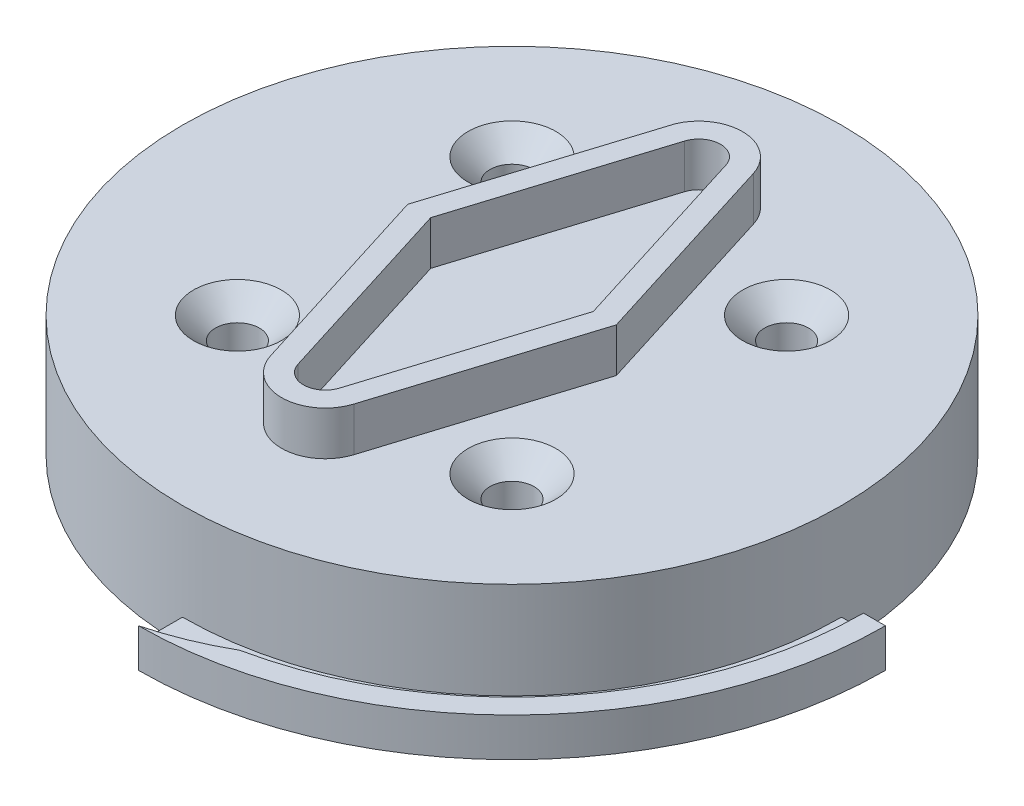
ISO-10303-21;
HEADER;
FILE_DESCRIPTION(('STEP AP214'),'2;1');
FILE_NAME('part.step','',(''),(''),'','','');
FILE_SCHEMA(('AUTOMOTIVE_DESIGN { 1 0 10303 214 1 1 1 1 }'));
ENDSEC;
DATA;
#1=APPLICATION_CONTEXT('core data for automotive mechanical design processes');
#2=APPLICATION_PROTOCOL_DEFINITION('international standard','automotive_design',2000,#1);
#3=PRODUCT_CONTEXT('',#1,'mechanical');
#4=PRODUCT('Part','Part','',(#3));
#5=PRODUCT_RELATED_PRODUCT_CATEGORY('part','',(#4));
#6=PRODUCT_DEFINITION_FORMATION('','',#4);
#7=PRODUCT_DEFINITION_CONTEXT('part definition',#1,'design');
#8=PRODUCT_DEFINITION('design','',#6,#7);
#9=PRODUCT_DEFINITION_SHAPE('','',#8);
#10=(LENGTH_UNIT() NAMED_UNIT(*) SI_UNIT(.MILLI.,.METRE.));
#11=(NAMED_UNIT(*) PLANE_ANGLE_UNIT() SI_UNIT($,.RADIAN.));
#12=(NAMED_UNIT(*) SI_UNIT($,.STERADIAN.) SOLID_ANGLE_UNIT());
#13=UNCERTAINTY_MEASURE_WITH_UNIT(LENGTH_MEASURE(1.E-05),#10,'distance_accuracy_value','');
#14=(GEOMETRIC_REPRESENTATION_CONTEXT(3) GLOBAL_UNCERTAINTY_ASSIGNED_CONTEXT((#13)) GLOBAL_UNIT_ASSIGNED_CONTEXT((#10,
#11,#12)) REPRESENTATION_CONTEXT('',''));
#15=CARTESIAN_POINT('',(0.,0.,0.));
#16=DIRECTION('',(0.,0.,1.));
#17=DIRECTION('',(1.,0.,0.));
#18=AXIS2_PLACEMENT_3D('',#15,#16,#17);
#19=CARTESIAN_POINT('',(0.,11.,0.));
#20=DIRECTION('',(0.,1.,0.));
#21=DIRECTION('',(0.,0.,1.));
#22=AXIS2_PLACEMENT_3D('',#19,#20,#21);
#23=PLANE('',#22);
#24=CARTESIAN_POINT('',(-12.5000000000001,11.,-12.5));
#25=DIRECTION('',(0.,1.,0.));
#26=DIRECTION('',(0.,0.,1.));
#27=AXIS2_PLACEMENT_3D('',#24,#25,#26);
#28=CIRCLE('',#27,4.00000000000002);
#29=CARTESIAN_POINT('',(-12.5000000000001,11.,-8.49999999999998));
#30=VERTEX_POINT('',#29);
#31=EDGE_CURVE('E436',#30,#30,#28,.F.);
#32=ORIENTED_EDGE('',*,*,#31,.T.);
#33=EDGE_LOOP('',(#32));
#34=FACE_BOUND('',#33,.T.);
#35=CARTESIAN_POINT('',(-12.5000000000001,11.,12.5));
#36=DIRECTION('',(0.,1.,0.));
#37=DIRECTION('',(0.,0.,1.));
#38=AXIS2_PLACEMENT_3D('',#35,#36,#37);
#39=CIRCLE('',#38,4.00000000000002);
#40=CARTESIAN_POINT('',(-12.5000000000001,11.,16.5));
#41=VERTEX_POINT('',#40);
#42=EDGE_CURVE('E433',#41,#41,#39,.F.);
#43=ORIENTED_EDGE('',*,*,#42,.T.);
#44=EDGE_LOOP('',(#43));
#45=FACE_BOUND('',#44,.T.);
#46=CARTESIAN_POINT('',(12.5000000000001,11.,12.5));
#47=DIRECTION('',(0.,1.,0.));
#48=DIRECTION('',(0.,0.,1.));
#49=AXIS2_PLACEMENT_3D('',#46,#47,#48);
#50=CIRCLE('',#49,4.00000000000002);
#51=CARTESIAN_POINT('',(12.5000000000001,11.,16.5));
#52=VERTEX_POINT('',#51);
#53=EDGE_CURVE('E430',#52,#52,#50,.F.);
#54=ORIENTED_EDGE('',*,*,#53,.T.);
#55=EDGE_LOOP('',(#54));
#56=FACE_BOUND('',#55,.T.);
#57=CARTESIAN_POINT('',(12.5000000000001,11.,-12.5));
#58=DIRECTION('',(0.,1.,0.));
#59=DIRECTION('',(0.,0.,1.));
#60=AXIS2_PLACEMENT_3D('',#57,#58,#59);
#61=CIRCLE('',#60,4.00000000000002);
#62=CARTESIAN_POINT('',(12.5000000000001,11.,-8.49999999999998));
#63=VERTEX_POINT('',#62);
#64=EDGE_CURVE('E427',#63,#63,#61,.F.);
#65=ORIENTED_EDGE('',*,*,#64,.T.);
#66=EDGE_LOOP('',(#65));
#67=FACE_BOUND('',#66,.T.);
#68=CARTESIAN_POINT('',(0.,11.,0.));
#69=DIRECTION('',(0.,1.,0.));
#70=DIRECTION('',(0.,0.,1.));
#71=AXIS2_PLACEMENT_3D('',#68,#69,#70);
#72=CIRCLE('',#71,30.);
#73=CARTESIAN_POINT('',(0.,11.,30.));
#74=VERTEX_POINT('',#73);
#75=EDGE_CURVE('E416',#74,#74,#72,.T.);
#76=ORIENTED_EDGE('',*,*,#75,.T.);
#77=EDGE_LOOP('',(#76));
#78=FACE_BOUND('',#77,.T.);
#79=CARTESIAN_POINT('',(-4.79311035306296E-10,11.,-16.999999998529));
#80=DIRECTION('',(0.,1.,0.));
#81=DIRECTION('',(0.,0.,1.));
#82=AXIS2_PLACEMENT_3D('',#79,#80,#81);
#83=CIRCLE('',#82,3.98000000074627);
#84=CARTESIAN_POINT('',(3.79777724661931,11.,-18.190499048239));
#85=VERTEX_POINT('',#84);
#86=CARTESIAN_POINT('',(-3.65990016683252,11.,-18.5638192906047));
#87=VERTEX_POINT('',#86);
#88=EDGE_CURVE('E67',#85,#87,#83,.T.);
#89=ORIENTED_EDGE('',*,*,#88,.F.);
#90=DIRECTION('',(-0.299120364192614,0.,-0.954215388539337));
#91=VECTOR('',#90,1.);
#92=CARTESIAN_POINT('',(8.6500065733898,11.,-2.71153991811169));
#93=LINE('',#92,#91);
#94=CARTESIAN_POINT('',(9.4999999999997,11.,2.43294967505747E-13));
#95=VERTEX_POINT('',#94);
#96=EDGE_CURVE('E277',#95,#85,#93,.T.);
#97=ORIENTED_EDGE('',*,*,#96,.F.);
#98=DIRECTION('',(-0.299120364192673,0.,0.954215388539319));
#99=VECTOR('',#98,1.);
#100=CARTESIAN_POINT('',(8.65000657338961,11.,2.71153991811221));
#101=LINE('',#100,#99);
#102=CARTESIAN_POINT('',(3.79777724631293,11.,18.1904990492129));
#103=VERTEX_POINT('',#102);
#104=EDGE_CURVE('E233',#95,#103,#101,.T.);
#105=ORIENTED_EDGE('',*,*,#104,.T.);
#106=CARTESIAN_POINT('',(-8.32667268468867E-13,11.,16.9999999997489));
#107=DIRECTION('',(0.,1.,0.));
#108=DIRECTION('',(0.,0.,1.));
#109=AXIS2_PLACEMENT_3D('',#106,#107,#108);
#110=CIRCLE('',#109,3.97999999992378);
#111=CARTESIAN_POINT('',(-3.79777724631466,11.,18.1904990492127));
#112=VERTEX_POINT('',#111);
#113=EDGE_CURVE('E286',#112,#103,#110,.T.);
#114=ORIENTED_EDGE('',*,*,#113,.F.);
#115=DIRECTION('',(0.299120364192616,0.,0.954215388539336));
#116=VECTOR('',#115,1.);
#117=CARTESIAN_POINT('',(-8.65000657339037,11.,2.71153991811188));
#118=LINE('',#117,#116);
#119=CARTESIAN_POINT('',(-9.5000000000003,11.,-1.0842021724855E-13));
#120=VERTEX_POINT('',#119);
#121=EDGE_CURVE('E283',#120,#112,#118,.T.);
#122=ORIENTED_EDGE('',*,*,#121,.F.);
#123=DIRECTION('',(0.300095799524208,0.,-0.95390906857411));
#124=VECTOR('',#123,1.);
#125=CARTESIAN_POINT('',(-8.6444538555256,11.,-2.71950899376793));
#126=LINE('',#125,#124);
#127=EDGE_CURVE('E281',#120,#87,#126,.T.);
#128=ORIENTED_EDGE('',*,*,#127,.T.);
#129=EDGE_LOOP('',(#89,#97,#105,#114,#122,#128));
#130=FACE_BOUND('',#129,.T.);
#131=ADVANCED_FACE('F43',(#34,#45,#56,#67,#78,#130),#23,.T.);
#132=CARTESIAN_POINT('',(0.,4.,-34.));
#133=DIRECTION('',(1.,0.,0.));
#134=DIRECTION('',(0.,0.,-1.));
#135=AXIS2_PLACEMENT_3D('',#132,#133,#134);
#136=PLANE('',#135);
#137=DIRECTION('',(0.,-1.,0.));
#138=VECTOR('',#137,1.);
#139=CARTESIAN_POINT('',(0.,4.,-34.));
#140=LINE('',#139,#138);
#141=CARTESIAN_POINT('',(0.,2.2,-34.));
#142=VERTEX_POINT('',#141);
#143=CARTESIAN_POINT('',(0.,0.,-34.));
#144=VERTEX_POINT('',#143);
#145=EDGE_CURVE('E405',#142,#144,#140,.T.);
#146=ORIENTED_EDGE('',*,*,#145,.F.);
#147=DIRECTION('',(0.,0.,1.));
#148=VECTOR('',#147,1.);
#149=CARTESIAN_POINT('',(0.,2.2,-34.));
#150=LINE('',#149,#148);
#151=CARTESIAN_POINT('',(0.,2.2,-30.));
#152=VERTEX_POINT('',#151);
#153=EDGE_CURVE('E372',#142,#152,#150,.T.);
#154=ORIENTED_EDGE('',*,*,#153,.T.);
#155=DIRECTION('',(0.,-1.,0.));
#156=VECTOR('',#155,1.);
#157=CARTESIAN_POINT('',(0.,4.,-30.));
#158=LINE('',#157,#156);
#159=CARTESIAN_POINT('',(0.,0.,-30.));
#160=VERTEX_POINT('',#159);
#161=EDGE_CURVE('E411',#152,#160,#158,.T.);
#162=ORIENTED_EDGE('',*,*,#161,.T.);
#163=DIRECTION('',(0.,0.,1.));
#164=VECTOR('',#163,1.);
#165=CARTESIAN_POINT('',(0.,0.,-34.));
#166=LINE('',#165,#164);
#167=EDGE_CURVE('E399',#144,#160,#166,.T.);
#168=ORIENTED_EDGE('',*,*,#167,.F.);
#169=EDGE_LOOP('',(#146,#154,#162,#168));
#170=FACE_BOUND('',#169,.T.);
#171=ADVANCED_FACE('F463',(#170),#136,.T.);
#172=CARTESIAN_POINT('',(0.,4.,34.));
#173=DIRECTION('',(-1.,0.,1.81278603239576E-13));
#174=DIRECTION('',(1.81278603239576E-13,0.,1.));
#175=AXIS2_PLACEMENT_3D('',#172,#173,#174);
#176=PLANE('',#175);
#177=DIRECTION('',(0.,-1.,0.));
#178=VECTOR('',#177,1.);
#179=CARTESIAN_POINT('',(0.,4.,34.));
#180=LINE('',#179,#178);
#181=CARTESIAN_POINT('',(3.24902603183742E-13,2.2,34.0000000000001));
#182=VERTEX_POINT('',#181);
#183=CARTESIAN_POINT('',(0.,0.,34.));
#184=VERTEX_POINT('',#183);
#185=EDGE_CURVE('E382',#182,#184,#180,.T.);
#186=ORIENTED_EDGE('',*,*,#185,.F.);
#187=DIRECTION('',(-1.81278603239576E-13,0.,-1.));
#188=VECTOR('',#187,1.);
#189=CARTESIAN_POINT('',(0.,2.2,34.));
#190=LINE('',#189,#188);
#191=CARTESIAN_POINT('',(-5.50774703622631E-13,2.2,30.0000000000001));
#192=VERTEX_POINT('',#191);
#193=EDGE_CURVE('E419',#182,#192,#190,.T.);
#194=ORIENTED_EDGE('',*,*,#193,.T.);
#195=DIRECTION('',(0.,-1.,0.));
#196=VECTOR('',#195,1.);
#197=CARTESIAN_POINT('',(-7.32053306862213E-13,4.,30.));
#198=LINE('',#197,#196);
#199=CARTESIAN_POINT('',(0.,0.,30.));
#200=VERTEX_POINT('',#199);
#201=EDGE_CURVE('E383',#192,#200,#198,.T.);
#202=ORIENTED_EDGE('',*,*,#201,.T.);
#203=DIRECTION('',(-1.81278603239576E-13,0.,-1.));
#204=VECTOR('',#203,1.);
#205=CARTESIAN_POINT('',(0.,0.,34.));
#206=LINE('',#205,#204);
#207=EDGE_CURVE('E390',#184,#200,#206,.T.);
#208=ORIENTED_EDGE('',*,*,#207,.F.);
#209=EDGE_LOOP('',(#186,#194,#202,#208));
#210=FACE_BOUND('',#209,.T.);
#211=ADVANCED_FACE('F471',(#210),#176,.T.);
#212=CARTESIAN_POINT('',(0.,4.,0.));
#213=DIRECTION('',(0.,-1.,0.));
#214=DIRECTION('',(0.,0.,-1.));
#215=AXIS2_PLACEMENT_3D('',#212,#213,#214);
#216=CYLINDRICAL_SURFACE('',#215,34.);
#217=DIRECTION('',(0.,-1.,0.));
#218=VECTOR('',#217,1.);
#219=CARTESIAN_POINT('',(-34.,4.,0.));
#220=LINE('',#219,#218);
#221=CARTESIAN_POINT('',(-34.0000000000001,3.52,0.));
#222=VERTEX_POINT('',#221);
#223=CARTESIAN_POINT('',(-34.,0.,0.));
#224=VERTEX_POINT('',#223);
#225=EDGE_CURVE('E406',#222,#224,#220,.T.);
#226=ORIENTED_EDGE('',*,*,#225,.F.);
#227=CARTESIAN_POINT('',(0.,3.52,0.));
#228=DIRECTION('',(0.,-1.,0.));
#229=DIRECTION('',(0.,0.,-1.));
#230=AXIS2_PLACEMENT_3D('',#227,#228,#229);
#231=CIRCLE('',#230,34.);
#232=CARTESIAN_POINT('',(0.,3.52,-34.));
#233=VERTEX_POINT('',#232);
#234=EDGE_CURVE('E336',#222,#233,#231,.T.);
#235=ORIENTED_EDGE('',*,*,#234,.T.);
#236=EDGE_CURVE('E413',#233,#142,#140,.T.);
#237=ORIENTED_EDGE('',*,*,#236,.T.);
#238=ORIENTED_EDGE('',*,*,#145,.T.);
#239=CARTESIAN_POINT('',(0.,0.,0.));
#240=DIRECTION('',(0.,-1.,0.));
#241=DIRECTION('',(0.,0.,-1.));
#242=AXIS2_PLACEMENT_3D('',#239,#240,#241);
#243=CIRCLE('',#242,34.);
#244=EDGE_CURVE('E396',#224,#144,#243,.T.);
#245=ORIENTED_EDGE('',*,*,#244,.F.);
#246=EDGE_LOOP('',(#226,#235,#237,#238,#245));
#247=FACE_BOUND('',#246,.T.);
#248=ADVANCED_FACE('F563',(#247),#216,.T.);
#249=CARTESIAN_POINT('',(-34.,4.,0.));
#250=DIRECTION('',(0.,0.,1.));
#251=DIRECTION('',(1.,0.,0.));
#252=AXIS2_PLACEMENT_3D('',#249,#250,#251);
#253=PLANE('',#252);
#254=DIRECTION('',(0.,-1.,0.));
#255=VECTOR('',#254,1.);
#256=CARTESIAN_POINT('',(-30.,4.,0.));
#257=LINE('',#256,#255);
#258=CARTESIAN_POINT('',(-30.0000000000001,2.2,0.));
#259=VERTEX_POINT('',#258);
#260=CARTESIAN_POINT('',(-30.,0.,0.));
#261=VERTEX_POINT('',#260);
#262=EDGE_CURVE('E409',#259,#261,#257,.T.);
#263=ORIENTED_EDGE('',*,*,#262,.F.);
#264=DIRECTION('',(-1.,0.,0.));
#265=VECTOR('',#264,1.);
#266=CARTESIAN_POINT('',(-34.,2.2,0.));
#267=LINE('',#266,#265);
#268=CARTESIAN_POINT('',(-32.0000000000001,2.2,0.));
#269=VERTEX_POINT('',#268);
#270=EDGE_CURVE('E374',#259,#269,#267,.T.);
#271=ORIENTED_EDGE('',*,*,#270,.T.);
#272=DIRECTION('',(0.,-1.,0.));
#273=VECTOR('',#272,1.);
#274=CARTESIAN_POINT('',(-32.0000000000001,0.,0.));
#275=LINE('',#274,#273);
#276=CARTESIAN_POINT('',(-32.0000000000001,3.52,0.));
#277=VERTEX_POINT('',#276);
#278=EDGE_CURVE('E366',#269,#277,#275,.F.);
#279=ORIENTED_EDGE('',*,*,#278,.T.);
#280=DIRECTION('',(-1.,0.,0.));
#281=VECTOR('',#280,1.);
#282=CARTESIAN_POINT('',(-34.,3.52,0.));
#283=LINE('',#282,#281);
#284=EDGE_CURVE('E360',#277,#222,#283,.T.);
#285=ORIENTED_EDGE('',*,*,#284,.T.);
#286=ORIENTED_EDGE('',*,*,#225,.T.);
#287=DIRECTION('',(-1.,0.,0.));
#288=VECTOR('',#287,1.);
#289=CARTESIAN_POINT('',(-34.,0.,0.));
#290=LINE('',#289,#288);
#291=EDGE_CURVE('E402',#261,#224,#290,.T.);
#292=ORIENTED_EDGE('',*,*,#291,.F.);
#293=EDGE_LOOP('',(#263,#271,#279,#285,#286,#292));
#294=FACE_BOUND('',#293,.T.);
#295=ADVANCED_FACE('F559',(#294),#253,.T.);
#296=CARTESIAN_POINT('',(0.,4.,0.));
#297=DIRECTION('',(0.,-1.,0.));
#298=DIRECTION('',(0.,0.,-1.));
#299=AXIS2_PLACEMENT_3D('',#296,#297,#298);
#300=CYLINDRICAL_SURFACE('',#299,34.);
#301=DIRECTION('',(0.,-1.,0.));
#302=VECTOR('',#301,1.);
#303=CARTESIAN_POINT('',(34.,4.,0.));
#304=LINE('',#303,#302);
#305=CARTESIAN_POINT('',(34.,3.52,0.));
#306=VERTEX_POINT('',#305);
#307=CARTESIAN_POINT('',(34.,0.,0.));
#308=VERTEX_POINT('',#307);
#309=EDGE_CURVE('E377',#306,#308,#304,.T.);
#310=ORIENTED_EDGE('',*,*,#309,.F.);
#311=CARTESIAN_POINT('',(3.24902603183742E-13,3.52,34.0000000000001));
#312=VERTEX_POINT('',#311);
#313=EDGE_CURVE('E344',#306,#312,#231,.T.);
#314=ORIENTED_EDGE('',*,*,#313,.T.);
#315=EDGE_CURVE('E378',#312,#182,#180,.T.);
#316=ORIENTED_EDGE('',*,*,#315,.T.);
#317=ORIENTED_EDGE('',*,*,#185,.T.);
#318=CARTESIAN_POINT('',(0.,0.,0.));
#319=DIRECTION('',(0.,-1.,0.));
#320=DIRECTION('',(0.,0.,1.));
#321=AXIS2_PLACEMENT_3D('',#318,#319,#320);
#322=CIRCLE('',#321,34.);
#323=EDGE_CURVE('E393',#308,#184,#322,.T.);
#324=ORIENTED_EDGE('',*,*,#323,.F.);
#325=EDGE_LOOP('',(#310,#314,#316,#317,#324));
#326=FACE_BOUND('',#325,.T.);
#327=ADVANCED_FACE('F555',(#326),#300,.T.);
#328=CARTESIAN_POINT('',(34.,4.,0.));
#329=DIRECTION('',(-1.86482773667507E-13,0.,-1.));
#330=DIRECTION('',(-1.,0.,1.86482773667507E-13));
#331=AXIS2_PLACEMENT_3D('',#328,#329,#330);
#332=PLANE('',#331);
#333=DIRECTION('',(0.,-1.,0.));
#334=VECTOR('',#333,1.);
#335=CARTESIAN_POINT('',(30.,4.,7.47906842746826E-13));
#336=LINE('',#335,#334);
#337=CARTESIAN_POINT('',(30.,2.2,5.52509427098613E-13));
#338=VERTEX_POINT('',#337);
#339=CARTESIAN_POINT('',(30.,0.,7.47906842746826E-13));
#340=VERTEX_POINT('',#339);
#341=EDGE_CURVE('E385',#338,#340,#336,.T.);
#342=ORIENTED_EDGE('',*,*,#341,.F.);
#343=DIRECTION('',(1.,0.,-1.86482773667507E-13));
#344=VECTOR('',#343,1.);
#345=CARTESIAN_POINT('',(34.,2.2,0.));
#346=LINE('',#345,#344);
#347=CARTESIAN_POINT('',(32.,2.2,3.66026653431106E-13));
#348=VERTEX_POINT('',#347);
#349=EDGE_CURVE('E369',#338,#348,#346,.T.);
#350=ORIENTED_EDGE('',*,*,#349,.T.);
#351=DIRECTION('',(0.,-1.,0.));
#352=VECTOR('',#351,1.);
#353=CARTESIAN_POINT('',(32.,0.,3.66026653431106E-13));
#354=LINE('',#353,#352);
#355=CARTESIAN_POINT('',(32.,3.52,3.66026653431106E-13));
#356=VERTEX_POINT('',#355);
#357=EDGE_CURVE('E363',#348,#356,#354,.F.);
#358=ORIENTED_EDGE('',*,*,#357,.T.);
#359=DIRECTION('',(1.,0.,-1.86482773667507E-13));
#360=VECTOR('',#359,1.);
#361=CARTESIAN_POINT('',(34.,3.52,0.));
#362=LINE('',#361,#360);
#363=EDGE_CURVE('E357',#356,#306,#362,.T.);
#364=ORIENTED_EDGE('',*,*,#363,.T.);
#365=ORIENTED_EDGE('',*,*,#309,.T.);
#366=DIRECTION('',(1.,0.,-1.86482773667507E-13));
#367=VECTOR('',#366,1.);
#368=CARTESIAN_POINT('',(34.,0.,0.));
#369=LINE('',#368,#367);
#370=EDGE_CURVE('E381',#340,#308,#369,.T.);
#371=ORIENTED_EDGE('',*,*,#370,.F.);
#372=EDGE_LOOP('',(#342,#350,#358,#364,#365,#371));
#373=FACE_BOUND('',#372,.T.);
#374=ADVANCED_FACE('F558',(#373),#332,.T.);
#375=CARTESIAN_POINT('',(0.,11.,0.));
#376=DIRECTION('',(0.,-1.,0.));
#377=DIRECTION('',(0.,0.,-1.));
#378=AXIS2_PLACEMENT_3D('',#375,#376,#377);
#379=CYLINDRICAL_SURFACE('',#378,30.);
#380=CARTESIAN_POINT('',(0.,2.2,0.));
#381=DIRECTION('',(0.,-1.,0.));
#382=DIRECTION('',(0.,0.,-1.));
#383=AXIS2_PLACEMENT_3D('',#380,#381,#382);
#384=CIRCLE('',#383,30.);
#385=EDGE_CURVE('E353',#259,#152,#384,.T.);
#386=ORIENTED_EDGE('',*,*,#385,.F.);
#387=ORIENTED_EDGE('',*,*,#262,.T.);
#388=CARTESIAN_POINT('',(0.,0.,0.));
#389=DIRECTION('',(0.,1.,0.));
#390=DIRECTION('',(0.,0.,1.));
#391=AXIS2_PLACEMENT_3D('',#388,#389,#390);
#392=CIRCLE('',#391,30.);
#393=EDGE_CURVE('E420',#261,#200,#392,.T.);
#394=ORIENTED_EDGE('',*,*,#393,.T.);
#395=ORIENTED_EDGE('',*,*,#201,.F.);
#396=EDGE_CURVE('E356',#338,#192,#384,.T.);
#397=ORIENTED_EDGE('',*,*,#396,.F.);
#398=ORIENTED_EDGE('',*,*,#341,.T.);
#399=EDGE_CURVE('E408',#340,#160,#392,.T.);
#400=ORIENTED_EDGE('',*,*,#399,.T.);
#401=ORIENTED_EDGE('',*,*,#161,.F.);
#402=EDGE_LOOP('',(#386,#387,#394,#395,#397,#398,#400,#401));
#403=FACE_BOUND('',#402,.T.);
#404=ORIENTED_EDGE('',*,*,#75,.F.);
#405=EDGE_LOOP('',(#404));
#406=FACE_BOUND('',#405,.T.);
#407=ADVANCED_FACE('F567',(#403,#406),#379,.T.);
#408=CARTESIAN_POINT('',(0.,0.,0.));
#409=DIRECTION('',(0.,1.,0.));
#410=DIRECTION('',(0.,0.,1.));
#411=AXIS2_PLACEMENT_3D('',#408,#409,#410);
#412=PLANE('',#411);
#413=CARTESIAN_POINT('',(-12.5000000000001,0.,-12.5));
#414=DIRECTION('',(0.,1.,0.));
#415=DIRECTION('',(0.,0.,1.));
#416=AXIS2_PLACEMENT_3D('',#413,#414,#415);
#417=CIRCLE('',#416,2.);
#418=CARTESIAN_POINT('',(-12.5000000000001,0.,-10.5));
#419=VERTEX_POINT('',#418);
#420=EDGE_CURVE('E306',#419,#419,#417,.T.);
#421=ORIENTED_EDGE('',*,*,#420,.T.);
#422=EDGE_LOOP('',(#421));
#423=FACE_BOUND('',#422,.T.);
#424=CARTESIAN_POINT('',(12.5000000000001,0.,12.5));
#425=DIRECTION('',(0.,1.,0.));
#426=DIRECTION('',(0.,0.,1.));
#427=AXIS2_PLACEMENT_3D('',#424,#425,#426);
#428=CIRCLE('',#427,2.);
#429=CARTESIAN_POINT('',(12.5000000000001,0.,14.5));
#430=VERTEX_POINT('',#429);
#431=EDGE_CURVE('E319',#430,#430,#428,.T.);
#432=ORIENTED_EDGE('',*,*,#431,.T.);
#433=EDGE_LOOP('',(#432));
#434=FACE_BOUND('',#433,.T.);
#435=CARTESIAN_POINT('',(-12.5000000000001,0.,12.5));
#436=DIRECTION('',(0.,1.,0.));
#437=DIRECTION('',(0.,0.,1.));
#438=AXIS2_PLACEMENT_3D('',#435,#436,#437);
#439=CIRCLE('',#438,2.);
#440=CARTESIAN_POINT('',(-12.5000000000001,0.,14.5));
#441=VERTEX_POINT('',#440);
#442=EDGE_CURVE('E315',#441,#441,#439,.T.);
#443=ORIENTED_EDGE('',*,*,#442,.T.);
#444=EDGE_LOOP('',(#443));
#445=FACE_BOUND('',#444,.T.);
#446=CARTESIAN_POINT('',(12.5000000000001,0.,-12.5));
#447=DIRECTION('',(0.,1.,0.));
#448=DIRECTION('',(0.,0.,1.));
#449=AXIS2_PLACEMENT_3D('',#446,#447,#448);
#450=CIRCLE('',#449,2.);
#451=CARTESIAN_POINT('',(12.5000000000001,0.,-10.5));
#452=VERTEX_POINT('',#451);
#453=EDGE_CURVE('E318',#452,#452,#450,.T.);
#454=ORIENTED_EDGE('',*,*,#453,.T.);
#455=EDGE_LOOP('',(#454));
#456=FACE_BOUND('',#455,.T.);
#457=ORIENTED_EDGE('',*,*,#393,.F.);
#458=ORIENTED_EDGE('',*,*,#291,.T.);
#459=ORIENTED_EDGE('',*,*,#244,.T.);
#460=ORIENTED_EDGE('',*,*,#167,.T.);
#461=ORIENTED_EDGE('',*,*,#399,.F.);
#462=ORIENTED_EDGE('',*,*,#370,.T.);
#463=ORIENTED_EDGE('',*,*,#323,.T.);
#464=ORIENTED_EDGE('',*,*,#207,.T.);
#465=EDGE_LOOP('',(#457,#458,#459,#460,#461,#462,#463,#464));
#466=FACE_BOUND('',#465,.T.);
#467=ADVANCED_FACE('F544',(#423,#434,#445,#456,#466),#412,.F.);
#468=CARTESIAN_POINT('',(32.,3.52,-5.96744875736021E-12));
#469=DIRECTION('',(0.,1.,0.));
#470=DIRECTION('',(0.,0.,1.));
#471=AXIS2_PLACEMENT_3D('',#468,#469,#470);
#472=PLANE('',#471);
#473=CARTESIAN_POINT('',(-6.88583794810361,3.52,7.89281256526369));
#474=DIRECTION('',(0.,1.,0.));
#475=DIRECTION('',(0.,0.,1.));
#476=AXIS2_PLACEMENT_3D('',#473,#474,#475);
#477=CIRCLE('',#476,27.0000000000001);
#478=CARTESIAN_POINT('',(6.52240808378166,3.52,31.3282331577863));
#479=VERTEX_POINT('',#478);
#480=EDGE_CURVE('E333',#312,#479,#477,.T.);
#481=ORIENTED_EDGE('',*,*,#480,.F.);
#482=ORIENTED_EDGE('',*,*,#313,.F.);
#483=ORIENTED_EDGE('',*,*,#363,.F.);
#484=CARTESIAN_POINT('',(0.,3.52,0.));
#485=DIRECTION('',(0.,-1.,0.));
#486=DIRECTION('',(0.,0.,-1.));
#487=AXIS2_PLACEMENT_3D('',#484,#485,#486);
#488=CIRCLE('',#487,32.);
#489=EDGE_CURVE('E348',#356,#479,#488,.T.);
#490=ORIENTED_EDGE('',*,*,#489,.T.);
#491=EDGE_LOOP('',(#481,#482,#483,#490));
#492=FACE_BOUND('',#491,.T.);
#493=ADVANCED_FACE('F540',(#492),#472,.T.);
#494=CARTESIAN_POINT('',(0.,0.,0.));
#495=DIRECTION('',(0.,-1.,0.));
#496=DIRECTION('',(0.,0.,-1.));
#497=AXIS2_PLACEMENT_3D('',#494,#495,#496);
#498=CYLINDRICAL_SURFACE('',#497,32.);
#499=DIRECTION('',(0.,1.,0.));
#500=VECTOR('',#499,1.);
#501=CARTESIAN_POINT('',(6.52240808378166,2.2,31.3282331577863));
#502=LINE('',#501,#500);
#503=CARTESIAN_POINT('',(6.52240808378175,2.2,31.3282331577863));
#504=VERTEX_POINT('',#503);
#505=EDGE_CURVE('E326',#504,#479,#502,.T.);
#506=ORIENTED_EDGE('',*,*,#505,.T.);
#507=ORIENTED_EDGE('',*,*,#489,.F.);
#508=ORIENTED_EDGE('',*,*,#357,.F.);
#509=CARTESIAN_POINT('',(0.,2.2,0.));
#510=DIRECTION('',(0.,-1.,0.));
#511=DIRECTION('',(0.,0.,-1.));
#512=AXIS2_PLACEMENT_3D('',#509,#510,#511);
#513=CIRCLE('',#512,32.);
#514=EDGE_CURVE('E352',#348,#504,#513,.T.);
#515=ORIENTED_EDGE('',*,*,#514,.T.);
#516=EDGE_LOOP('',(#506,#507,#508,#515));
#517=FACE_BOUND('',#516,.T.);
#518=ADVANCED_FACE('F543',(#517),#498,.F.);
#519=CARTESIAN_POINT('',(30.,2.2,-5.5944832100252E-12));
#520=DIRECTION('',(0.,1.,0.));
#521=DIRECTION('',(0.,0.,1.));
#522=AXIS2_PLACEMENT_3D('',#519,#520,#521);
#523=PLANE('',#522);
#524=ORIENTED_EDGE('',*,*,#396,.T.);
#525=ORIENTED_EDGE('',*,*,#193,.F.);
#526=CARTESIAN_POINT('',(-6.88583794810361,2.2,7.89281256526369));
#527=DIRECTION('',(0.,1.,0.));
#528=DIRECTION('',(0.,0.,1.));
#529=AXIS2_PLACEMENT_3D('',#526,#527,#528);
#530=CIRCLE('',#529,27.0000000000001);
#531=EDGE_CURVE('E339',#182,#504,#530,.T.);
#532=ORIENTED_EDGE('',*,*,#531,.T.);
#533=ORIENTED_EDGE('',*,*,#514,.F.);
#534=ORIENTED_EDGE('',*,*,#349,.F.);
#535=EDGE_LOOP('',(#524,#525,#532,#533,#534));
#536=FACE_BOUND('',#535,.T.);
#537=ADVANCED_FACE('F548',(#536),#523,.T.);
#538=ORIENTED_EDGE('',*,*,#385,.T.);
#539=ORIENTED_EDGE('',*,*,#153,.F.);
#540=CARTESIAN_POINT('',(6.88583794810347,2.2,-7.8928125652636));
#541=DIRECTION('',(0.,1.,0.));
#542=DIRECTION('',(0.,0.,1.));
#543=AXIS2_PLACEMENT_3D('',#540,#541,#542);
#544=CIRCLE('',#543,27.);
#545=CARTESIAN_POINT('',(-6.52240808378171,2.2,-31.3282331577863));
#546=VERTEX_POINT('',#545);
#547=EDGE_CURVE('E327',#142,#546,#544,.T.);
#548=ORIENTED_EDGE('',*,*,#547,.T.);
#549=EDGE_CURVE('E349',#269,#546,#513,.T.);
#550=ORIENTED_EDGE('',*,*,#549,.F.);
#551=ORIENTED_EDGE('',*,*,#270,.F.);
#552=EDGE_LOOP('',(#538,#539,#548,#550,#551));
#553=FACE_BOUND('',#552,.T.);
#554=ADVANCED_FACE('F553',(#553),#523,.T.);
#555=DIRECTION('',(0.,1.,0.));
#556=VECTOR('',#555,1.);
#557=CARTESIAN_POINT('',(-6.52240808378171,2.2,-31.3282331577863));
#558=LINE('',#557,#556);
#559=CARTESIAN_POINT('',(-6.52240808378171,3.52,-31.3282331577863));
#560=VERTEX_POINT('',#559);
#561=EDGE_CURVE('E330',#546,#560,#558,.T.);
#562=ORIENTED_EDGE('',*,*,#561,.T.);
#563=EDGE_CURVE('E345',#277,#560,#488,.T.);
#564=ORIENTED_EDGE('',*,*,#563,.F.);
#565=ORIENTED_EDGE('',*,*,#278,.F.);
#566=ORIENTED_EDGE('',*,*,#549,.T.);
#567=EDGE_LOOP('',(#562,#564,#565,#566));
#568=FACE_BOUND('',#567,.T.);
#569=ADVANCED_FACE('F550',(#568),#498,.F.);
#570=CARTESIAN_POINT('',(6.88583794810347,3.52,-7.8928125652636));
#571=DIRECTION('',(0.,1.,0.));
#572=DIRECTION('',(0.,0.,1.));
#573=AXIS2_PLACEMENT_3D('',#570,#571,#572);
#574=CIRCLE('',#573,27.);
#575=EDGE_CURVE('E331',#233,#560,#574,.T.);
#576=ORIENTED_EDGE('',*,*,#575,.F.);
#577=ORIENTED_EDGE('',*,*,#234,.F.);
#578=ORIENTED_EDGE('',*,*,#284,.F.);
#579=ORIENTED_EDGE('',*,*,#563,.T.);
#580=EDGE_LOOP('',(#576,#577,#578,#579));
#581=FACE_BOUND('',#580,.T.);
#582=ADVANCED_FACE('F535',(#581),#472,.T.);
#583=CARTESIAN_POINT('',(6.88583794810347,2.2,-7.8928125652636));
#584=DIRECTION('',(0.,1.,0.));
#585=DIRECTION('',(0.,0.,1.));
#586=AXIS2_PLACEMENT_3D('',#583,#584,#585);
#587=CYLINDRICAL_SURFACE('',#586,27.);
#588=ORIENTED_EDGE('',*,*,#575,.T.);
#589=ORIENTED_EDGE('',*,*,#561,.F.);
#590=ORIENTED_EDGE('',*,*,#547,.F.);
#591=ORIENTED_EDGE('',*,*,#236,.F.);
#592=EDGE_LOOP('',(#588,#589,#590,#591));
#593=FACE_BOUND('',#592,.T.);
#594=ADVANCED_FACE('F532',(#593),#587,.F.);
#595=CARTESIAN_POINT('',(-6.88583794810361,2.2,7.89281256526369));
#596=DIRECTION('',(0.,1.,0.));
#597=DIRECTION('',(0.,0.,1.));
#598=AXIS2_PLACEMENT_3D('',#595,#596,#597);
#599=CYLINDRICAL_SURFACE('',#598,27.0000000000001);
#600=ORIENTED_EDGE('',*,*,#480,.T.);
#601=ORIENTED_EDGE('',*,*,#505,.F.);
#602=ORIENTED_EDGE('',*,*,#531,.F.);
#603=ORIENTED_EDGE('',*,*,#315,.F.);
#604=EDGE_LOOP('',(#600,#601,#602,#603));
#605=FACE_BOUND('',#604,.T.);
#606=ADVANCED_FACE('F530',(#605),#599,.F.);
#607=CARTESIAN_POINT('',(12.5000000000001,0.,-12.5));
#608=DIRECTION('',(0.,1.,0.));
#609=DIRECTION('',(0.,0.,1.));
#610=AXIS2_PLACEMENT_3D('',#607,#608,#609);
#611=CYLINDRICAL_SURFACE('',#610,2.);
#612=CARTESIAN_POINT('',(12.5000000000001,8.99999999999999,-12.5));
#613=DIRECTION('',(0.,1.,0.));
#614=DIRECTION('',(0.,0.,1.));
#615=AXIS2_PLACEMENT_3D('',#612,#613,#614);
#616=CIRCLE('',#615,2.);
#617=CARTESIAN_POINT('',(12.5000000000001,8.99999999999999,-10.5));
#618=VERTEX_POINT('',#617);
#619=EDGE_CURVE('E11',#618,#618,#616,.T.);
#620=ORIENTED_EDGE('',*,*,#619,.T.);
#621=EDGE_LOOP('',(#620));
#622=FACE_BOUND('',#621,.T.);
#623=ORIENTED_EDGE('',*,*,#453,.F.);
#624=EDGE_LOOP('',(#623));
#625=FACE_BOUND('',#624,.T.);
#626=ADVANCED_FACE('F520',(#622,#625),#611,.F.);
#627=CARTESIAN_POINT('',(-12.5000000000001,0.,12.5));
#628=DIRECTION('',(0.,1.,0.));
#629=DIRECTION('',(0.,0.,1.));
#630=AXIS2_PLACEMENT_3D('',#627,#628,#629);
#631=CYLINDRICAL_SURFACE('',#630,2.);
#632=CARTESIAN_POINT('',(-12.5000000000001,8.99999999999999,12.5));
#633=DIRECTION('',(0.,1.,0.));
#634=DIRECTION('',(0.,0.,1.));
#635=AXIS2_PLACEMENT_3D('',#632,#633,#634);
#636=CIRCLE('',#635,2.);
#637=CARTESIAN_POINT('',(-12.5000000000001,8.99999999999999,14.5));
#638=VERTEX_POINT('',#637);
#639=EDGE_CURVE('E439',#638,#638,#636,.T.);
#640=ORIENTED_EDGE('',*,*,#639,.T.);
#641=EDGE_LOOP('',(#640));
#642=FACE_BOUND('',#641,.T.);
#643=ORIENTED_EDGE('',*,*,#442,.F.);
#644=EDGE_LOOP('',(#643));
#645=FACE_BOUND('',#644,.T.);
#646=ADVANCED_FACE('F517',(#642,#645),#631,.F.);
#647=CARTESIAN_POINT('',(12.5000000000001,0.,12.5));
#648=DIRECTION('',(0.,1.,0.));
#649=DIRECTION('',(0.,0.,1.));
#650=AXIS2_PLACEMENT_3D('',#647,#648,#649);
#651=CYLINDRICAL_SURFACE('',#650,2.);
#652=CARTESIAN_POINT('',(12.5000000000001,8.99999999999999,12.5));
#653=DIRECTION('',(0.,1.,0.));
#654=DIRECTION('',(0.,0.,1.));
#655=AXIS2_PLACEMENT_3D('',#652,#653,#654);
#656=CIRCLE('',#655,2.);
#657=CARTESIAN_POINT('',(12.5000000000001,8.99999999999999,14.5));
#658=VERTEX_POINT('',#657);
#659=EDGE_CURVE('E52',#658,#658,#656,.T.);
#660=ORIENTED_EDGE('',*,*,#659,.T.);
#661=EDGE_LOOP('',(#660));
#662=FACE_BOUND('',#661,.T.);
#663=ORIENTED_EDGE('',*,*,#431,.F.);
#664=EDGE_LOOP('',(#663));
#665=FACE_BOUND('',#664,.T.);
#666=ADVANCED_FACE('F444',(#662,#665),#651,.F.);
#667=CARTESIAN_POINT('',(-12.5000000000001,0.,-12.5));
#668=DIRECTION('',(0.,1.,0.));
#669=DIRECTION('',(0.,0.,1.));
#670=AXIS2_PLACEMENT_3D('',#667,#668,#669);
#671=CYLINDRICAL_SURFACE('',#670,2.);
#672=CARTESIAN_POINT('',(-12.5000000000001,8.99999999999999,-12.5));
#673=DIRECTION('',(0.,1.,0.));
#674=DIRECTION('',(0.,0.,1.));
#675=AXIS2_PLACEMENT_3D('',#672,#673,#674);
#676=CIRCLE('',#675,2.);
#677=CARTESIAN_POINT('',(-12.5000000000001,8.99999999999999,-10.5));
#678=VERTEX_POINT('',#677);
#679=EDGE_CURVE('E424',#678,#678,#676,.T.);
#680=ORIENTED_EDGE('',*,*,#679,.T.);
#681=EDGE_LOOP('',(#680));
#682=FACE_BOUND('',#681,.T.);
#683=ORIENTED_EDGE('',*,*,#420,.F.);
#684=EDGE_LOOP('',(#683));
#685=FACE_BOUND('',#684,.T.);
#686=ADVANCED_FACE('F524',(#682,#685),#671,.F.);
#687=CARTESIAN_POINT('',(-12.5000000000001,8.99999999999999,-12.5));
#688=DIRECTION('',(0.,1.,0.));
#689=DIRECTION('',(0.,0.,1.));
#690=AXIS2_PLACEMENT_3D('',#687,#688,#689);
#691=CONICAL_SURFACE('',#690,2.,0.78539816339745);
#692=ORIENTED_EDGE('',*,*,#31,.F.);
#693=EDGE_LOOP('',(#692));
#694=FACE_BOUND('',#693,.T.);
#695=ORIENTED_EDGE('',*,*,#679,.F.);
#696=EDGE_LOOP('',(#695));
#697=FACE_BOUND('',#696,.T.);
#698=ADVANCED_FACE('F457',(#694,#697),#691,.F.);
#699=CARTESIAN_POINT('',(-12.5000000000001,8.99999999999999,12.5));
#700=DIRECTION('',(0.,1.,0.));
#701=DIRECTION('',(0.,0.,1.));
#702=AXIS2_PLACEMENT_3D('',#699,#700,#701);
#703=CONICAL_SURFACE('',#702,2.,0.78539816339745);
#704=ORIENTED_EDGE('',*,*,#42,.F.);
#705=EDGE_LOOP('',(#704));
#706=FACE_BOUND('',#705,.T.);
#707=ORIENTED_EDGE('',*,*,#639,.F.);
#708=EDGE_LOOP('',(#707));
#709=FACE_BOUND('',#708,.T.);
#710=ADVANCED_FACE('F449',(#706,#709),#703,.F.);
#711=CARTESIAN_POINT('',(12.5000000000001,8.99999999999999,12.5));
#712=DIRECTION('',(0.,1.,0.));
#713=DIRECTION('',(0.,0.,1.));
#714=AXIS2_PLACEMENT_3D('',#711,#712,#713);
#715=CONICAL_SURFACE('',#714,2.,0.78539816339745);
#716=ORIENTED_EDGE('',*,*,#53,.F.);
#717=EDGE_LOOP('',(#716));
#718=FACE_BOUND('',#717,.T.);
#719=ORIENTED_EDGE('',*,*,#659,.F.);
#720=EDGE_LOOP('',(#719));
#721=FACE_BOUND('',#720,.T.);
#722=ADVANCED_FACE('F447',(#718,#721),#715,.F.);
#723=CARTESIAN_POINT('',(12.5000000000001,8.99999999999999,-12.5));
#724=DIRECTION('',(0.,1.,0.));
#725=DIRECTION('',(0.,0.,1.));
#726=AXIS2_PLACEMENT_3D('',#723,#724,#725);
#727=CONICAL_SURFACE('',#726,2.,0.78539816339745);
#728=ORIENTED_EDGE('',*,*,#64,.F.);
#729=EDGE_LOOP('',(#728));
#730=FACE_BOUND('',#729,.T.);
#731=ORIENTED_EDGE('',*,*,#619,.F.);
#732=EDGE_LOOP('',(#731));
#733=FACE_BOUND('',#732,.T.);
#734=ADVANCED_FACE('F46',(#730,#733),#727,.F.);
#735=CARTESIAN_POINT('',(8.6500065733898,15.,-2.71153991811169));
#736=DIRECTION('',(-0.954215388539337,0.,0.299120364192614));
#737=DIRECTION('',(0.299120364192614,0.,0.954215388539337));
#738=AXIS2_PLACEMENT_3D('',#735,#736,#737);
#739=PLANE('',#738);
#740=ORIENTED_EDGE('',*,*,#96,.T.);
#741=DIRECTION('',(0.,-1.,0.));
#742=VECTOR('',#741,1.);
#743=CARTESIAN_POINT('',(3.79777724661931,15.,-18.190499048239));
#744=LINE('',#743,#742);
#745=CARTESIAN_POINT('',(3.79777724661931,15.,-18.190499048239));
#746=VERTEX_POINT('',#745);
#747=EDGE_CURVE('E304',#746,#85,#744,.T.);
#748=ORIENTED_EDGE('',*,*,#747,.F.);
#749=DIRECTION('',(-0.299120364192614,0.,-0.954215388539337));
#750=VECTOR('',#749,1.);
#751=CARTESIAN_POINT('',(8.6500065733898,15.,-2.71153991811169));
#752=LINE('',#751,#750);
#753=CARTESIAN_POINT('',(9.4999999999997,15.,2.43294967505747E-13));
#754=VERTEX_POINT('',#753);
#755=EDGE_CURVE('E248',#754,#746,#752,.T.);
#756=ORIENTED_EDGE('',*,*,#755,.F.);
#757=DIRECTION('',(0.,-1.,0.));
#758=VECTOR('',#757,1.);
#759=CARTESIAN_POINT('',(9.4999999999997,15.,2.43294967505747E-13));
#760=LINE('',#759,#758);
#761=EDGE_CURVE('E221',#754,#95,#760,.T.);
#762=ORIENTED_EDGE('',*,*,#761,.T.);
#763=EDGE_LOOP('',(#740,#748,#756,#762));
#764=FACE_BOUND('',#763,.T.);
#765=ADVANCED_FACE('F455',(#764),#739,.F.);
#766=CARTESIAN_POINT('',(-4.79311035306296E-10,15.,-16.999999998529));
#767=DIRECTION('',(0.,-1.,0.));
#768=DIRECTION('',(0.,0.,-1.));
#769=AXIS2_PLACEMENT_3D('',#766,#767,#768);
#770=CYLINDRICAL_SURFACE('',#769,3.98000000074627);
#771=ORIENTED_EDGE('',*,*,#88,.T.);
#772=DIRECTION('',(0.,-1.,0.));
#773=VECTOR('',#772,1.);
#774=CARTESIAN_POINT('',(-3.65990016683253,15.,-18.5638192906047));
#775=LINE('',#774,#773);
#776=CARTESIAN_POINT('',(-3.65990016683253,15.,-18.5638192906047));
#777=VERTEX_POINT('',#776);
#778=EDGE_CURVE('E301',#777,#87,#775,.T.);
#779=ORIENTED_EDGE('',*,*,#778,.F.);
#780=CARTESIAN_POINT('',(-4.79311035306296E-10,15.,-16.999999998529));
#781=DIRECTION('',(0.,1.,0.));
#782=DIRECTION('',(0.,0.,1.));
#783=AXIS2_PLACEMENT_3D('',#780,#781,#782);
#784=CIRCLE('',#783,3.98000000074627);
#785=EDGE_CURVE('E251',#746,#777,#784,.T.);
#786=ORIENTED_EDGE('',*,*,#785,.F.);
#787=ORIENTED_EDGE('',*,*,#747,.T.);
#788=EDGE_LOOP('',(#771,#779,#786,#787));
#789=FACE_BOUND('',#788,.T.);
#790=ADVANCED_FACE('F679',(#789),#770,.T.);
#791=CARTESIAN_POINT('',(-8.6444538555256,15.,-2.71950899376793));
#792=DIRECTION('',(-0.95390906857411,0.,-0.300095799524208));
#793=DIRECTION('',(-0.300095799524208,0.,0.95390906857411));
#794=AXIS2_PLACEMENT_3D('',#791,#792,#793);
#795=PLANE('',#794);
#796=ORIENTED_EDGE('',*,*,#127,.F.);
#797=DIRECTION('',(0.,-1.,0.));
#798=VECTOR('',#797,1.);
#799=CARTESIAN_POINT('',(-9.5000000000003,15.,-1.07986536379556E-13));
#800=LINE('',#799,#798);
#801=CARTESIAN_POINT('',(-9.5000000000003,15.,-1.07986536379556E-13));
#802=VERTEX_POINT('',#801);
#803=EDGE_CURVE('E298',#802,#120,#800,.T.);
#804=ORIENTED_EDGE('',*,*,#803,.F.);
#805=DIRECTION('',(0.300095799524208,0.,-0.95390906857411));
#806=VECTOR('',#805,1.);
#807=CARTESIAN_POINT('',(-8.6444538555256,15.,-2.71950899376793));
#808=LINE('',#807,#806);
#809=EDGE_CURVE('E253',#802,#777,#808,.T.);
#810=ORIENTED_EDGE('',*,*,#809,.T.);
#811=ORIENTED_EDGE('',*,*,#778,.T.);
#812=EDGE_LOOP('',(#796,#804,#810,#811));
#813=FACE_BOUND('',#812,.T.);
#814=ADVANCED_FACE('F688',(#813),#795,.T.);
#815=CARTESIAN_POINT('',(-8.65000657339037,15.,2.71153991811188));
#816=DIRECTION('',(0.954215388539336,0.,-0.299120364192616));
#817=DIRECTION('',(-0.299120364192616,0.,-0.954215388539336));
#818=AXIS2_PLACEMENT_3D('',#815,#816,#817);
#819=PLANE('',#818);
#820=ORIENTED_EDGE('',*,*,#121,.T.);
#821=DIRECTION('',(0.,-1.,0.));
#822=VECTOR('',#821,1.);
#823=CARTESIAN_POINT('',(-3.79777724631467,15.,18.1904990492127));
#824=LINE('',#823,#822);
#825=CARTESIAN_POINT('',(-3.79777724631467,15.,18.1904990492127));
#826=VERTEX_POINT('',#825);
#827=EDGE_CURVE('E295',#826,#112,#824,.T.);
#828=ORIENTED_EDGE('',*,*,#827,.F.);
#829=DIRECTION('',(0.299120364192616,0.,0.954215388539336));
#830=VECTOR('',#829,1.);
#831=CARTESIAN_POINT('',(-8.65000657339037,15.,2.71153991811188));
#832=LINE('',#831,#830);
#833=EDGE_CURVE('E256',#802,#826,#832,.T.);
#834=ORIENTED_EDGE('',*,*,#833,.F.);
#835=ORIENTED_EDGE('',*,*,#803,.T.);
#836=EDGE_LOOP('',(#820,#828,#834,#835));
#837=FACE_BOUND('',#836,.T.);
#838=ADVANCED_FACE('F697',(#837),#819,.F.);
#839=CARTESIAN_POINT('',(-8.32667268468867E-13,15.,16.9999999997489));
#840=DIRECTION('',(0.,-1.,0.));
#841=DIRECTION('',(0.,0.,-1.));
#842=AXIS2_PLACEMENT_3D('',#839,#840,#841);
#843=CYLINDRICAL_SURFACE('',#842,3.97999999992378);
#844=ORIENTED_EDGE('',*,*,#113,.T.);
#845=DIRECTION('',(0.,-1.,0.));
#846=VECTOR('',#845,1.);
#847=CARTESIAN_POINT('',(3.79777724631293,15.,18.1904990492129));
#848=LINE('',#847,#846);
#849=CARTESIAN_POINT('',(3.79777724631293,15.,18.1904990492129));
#850=VERTEX_POINT('',#849);
#851=EDGE_CURVE('E292',#850,#103,#848,.T.);
#852=ORIENTED_EDGE('',*,*,#851,.F.);
#853=CARTESIAN_POINT('',(-8.32667268468867E-13,15.,16.9999999997489));
#854=DIRECTION('',(0.,1.,0.));
#855=DIRECTION('',(0.,0.,1.));
#856=AXIS2_PLACEMENT_3D('',#853,#854,#855);
#857=CIRCLE('',#856,3.97999999992378);
#858=EDGE_CURVE('E258',#826,#850,#857,.T.);
#859=ORIENTED_EDGE('',*,*,#858,.F.);
#860=ORIENTED_EDGE('',*,*,#827,.T.);
#861=EDGE_LOOP('',(#844,#852,#859,#860));
#862=FACE_BOUND('',#861,.T.);
#863=ADVANCED_FACE('F516',(#862),#843,.T.);
#864=CARTESIAN_POINT('',(-8.32667268468867E-13,15.,16.9999999997489));
#865=DIRECTION('',(0.,-1.,0.));
#866=DIRECTION('',(0.,0.,-1.));
#867=AXIS2_PLACEMENT_3D('',#864,#865,#866);
#868=CYLINDRICAL_SURFACE('',#867,1.97999999992853);
#869=CARTESIAN_POINT('',(-8.32667268468867E-13,11.,16.9999999997489));
#870=DIRECTION('',(0.,1.,0.));
#871=DIRECTION('',(0.,0.,1.));
#872=AXIS2_PLACEMENT_3D('',#869,#870,#871);
#873=CIRCLE('',#872,1.97999999992853);
#874=CARTESIAN_POINT('',(-1.88947019108193,11.,17.5918634947652));
#875=VERTEX_POINT('',#874);
#876=CARTESIAN_POINT('',(1.88947019110961,11.,17.5918634946716));
#877=VERTEX_POINT('',#876);
#878=EDGE_CURVE('E216',#875,#877,#873,.T.);
#879=ORIENTED_EDGE('',*,*,#878,.F.);
#880=DIRECTION('',(0.,-1.,0.));
#881=VECTOR('',#880,1.);
#882=CARTESIAN_POINT('',(-1.88947019108193,15.,17.5918634947652));
#883=LINE('',#882,#881);
#884=CARTESIAN_POINT('',(-1.88947019108193,15.,17.5918634947652));
#885=VERTEX_POINT('',#884);
#886=EDGE_CURVE('E211',#885,#875,#883,.T.);
#887=ORIENTED_EDGE('',*,*,#886,.F.);
#888=CARTESIAN_POINT('',(-8.32667268468867E-13,15.,16.9999999997489));
#889=DIRECTION('',(0.,1.,0.));
#890=DIRECTION('',(0.,0.,1.));
#891=AXIS2_PLACEMENT_3D('',#888,#889,#890);
#892=CIRCLE('',#891,1.97999999992853);
#893=CARTESIAN_POINT('',(1.88947019110961,15.,17.5918634946716));
#894=VERTEX_POINT('',#893);
#895=EDGE_CURVE('E214',#885,#894,#892,.T.);
#896=ORIENTED_EDGE('',*,*,#895,.T.);
#897=DIRECTION('',(0.,-1.,0.));
#898=VECTOR('',#897,1.);
#899=CARTESIAN_POINT('',(1.88947019110961,15.,17.5918634946716));
#900=LINE('',#899,#898);
#901=EDGE_CURVE('E263',#894,#877,#900,.T.);
#902=ORIENTED_EDGE('',*,*,#901,.T.);
#903=EDGE_LOOP('',(#879,#887,#896,#902));
#904=FACE_BOUND('',#903,.T.);
#905=ADVANCED_FACE('F213',(#904),#868,.F.);
#906=CARTESIAN_POINT('',(-6.73878233486121,15.,2.11087705098068));
#907=DIRECTION('',(0.95427787431783,0.,-0.298920957089737));
#908=DIRECTION('',(-0.298920957089737,0.,-0.95427787431783));
#909=AXIS2_PLACEMENT_3D('',#906,#907,#908);
#910=PLANE('',#909);
#911=DIRECTION('',(0.298920957089737,0.,0.95427787431783));
#912=VECTOR('',#911,1.);
#913=CARTESIAN_POINT('',(-6.73878233486121,11.,2.11087705098068));
#914=LINE('',#913,#912);
#915=CARTESIAN_POINT('',(-7.40000000047969,11.,-9.99911958787791E-11));
#916=VERTEX_POINT('',#915);
#917=EDGE_CURVE('E265',#916,#875,#914,.T.);
#918=ORIENTED_EDGE('',*,*,#917,.F.);
#919=DIRECTION('',(0.,-1.,0.));
#920=VECTOR('',#919,1.);
#921=CARTESIAN_POINT('',(-7.40000000047969,15.,-9.99911958787791E-11));
#922=LINE('',#921,#920);
#923=CARTESIAN_POINT('',(-7.40000000047969,15.,-9.99911958787791E-11));
#924=VERTEX_POINT('',#923);
#925=EDGE_CURVE('E222',#924,#916,#922,.T.);
#926=ORIENTED_EDGE('',*,*,#925,.F.);
#927=DIRECTION('',(0.298920957089737,0.,0.95427787431783));
#928=VECTOR('',#927,1.);
#929=CARTESIAN_POINT('',(-6.73878233486121,15.,2.11087705098068));
#930=LINE('',#929,#928);
#931=EDGE_CURVE('E228',#924,#885,#930,.T.);
#932=ORIENTED_EDGE('',*,*,#931,.T.);
#933=ORIENTED_EDGE('',*,*,#886,.T.);
#934=EDGE_LOOP('',(#918,#926,#932,#933));
#935=FACE_BOUND('',#934,.T.);
#936=ADVANCED_FACE('F235',(#935),#910,.T.);
#937=CARTESIAN_POINT('',(-6.73878233504777,15.,-2.1108770508121));
#938=DIRECTION('',(-0.954277874327,0.,-0.298920957060463));
#939=DIRECTION('',(-0.298920957060463,0.,0.954277874327));
#940=AXIS2_PLACEMENT_3D('',#937,#938,#939);
#941=PLANE('',#940);
#942=DIRECTION('',(0.298920957060463,0.,-0.954277874327));
#943=VECTOR('',#942,1.);
#944=CARTESIAN_POINT('',(-6.73878233504777,11.,-2.1108770508121));
#945=LINE('',#944,#943);
#946=CARTESIAN_POINT('',(-1.88947019208753,11.,-17.5918634936468));
#947=VERTEX_POINT('',#946);
#948=EDGE_CURVE('E267',#916,#947,#945,.T.);
#949=ORIENTED_EDGE('',*,*,#948,.T.);
#950=DIRECTION('',(0.,-1.,0.));
#951=VECTOR('',#950,1.);
#952=CARTESIAN_POINT('',(-1.88947019208753,15.,-17.5918634936468));
#953=LINE('',#952,#951);
#954=CARTESIAN_POINT('',(-1.88947019208753,15.,-17.5918634936468));
#955=VERTEX_POINT('',#954);
#956=EDGE_CURVE('E312',#955,#947,#953,.T.);
#957=ORIENTED_EDGE('',*,*,#956,.F.);
#958=DIRECTION('',(0.298920957060463,0.,-0.954277874327));
#959=VECTOR('',#958,1.);
#960=CARTESIAN_POINT('',(-6.73878233504777,15.,-2.1108770508121));
#961=LINE('',#960,#959);
#962=EDGE_CURVE('E237',#924,#955,#961,.T.);
#963=ORIENTED_EDGE('',*,*,#962,.F.);
#964=ORIENTED_EDGE('',*,*,#925,.T.);
#965=EDGE_LOOP('',(#949,#957,#963,#964));
#966=FACE_BOUND('',#965,.T.);
#967=ADVANCED_FACE('F489',(#966),#941,.F.);
#968=CARTESIAN_POINT('',(-4.79311035306296E-10,15.,-16.999999998529));
#969=DIRECTION('',(0.,-1.,0.));
#970=DIRECTION('',(0.,0.,-1.));
#971=AXIS2_PLACEMENT_3D('',#968,#969,#970);
#972=CYLINDRICAL_SURFACE('',#971,1.98000000046188);
#973=CARTESIAN_POINT('',(-4.79311035306296E-10,11.,-16.999999998529));
#974=DIRECTION('',(0.,1.,0.));
#975=DIRECTION('',(0.,0.,1.));
#976=AXIS2_PLACEMENT_3D('',#973,#974,#975);
#977=CIRCLE('',#976,1.98000000046188);
#978=CARTESIAN_POINT('',(1.88947019112893,11.,-17.5918634936467));
#979=VERTEX_POINT('',#978);
#980=EDGE_CURVE('E270',#979,#947,#977,.T.);
#981=ORIENTED_EDGE('',*,*,#980,.F.);
#982=DIRECTION('',(0.,-1.,0.));
#983=VECTOR('',#982,1.);
#984=CARTESIAN_POINT('',(1.88947019112893,15.,-17.5918634936467));
#985=LINE('',#984,#983);
#986=CARTESIAN_POINT('',(1.88947019112893,15.,-17.5918634936467));
#987=VERTEX_POINT('',#986);
#988=EDGE_CURVE('E310',#987,#979,#985,.T.);
#989=ORIENTED_EDGE('',*,*,#988,.F.);
#990=CARTESIAN_POINT('',(-4.79311035306296E-10,15.,-16.999999998529));
#991=DIRECTION('',(0.,1.,0.));
#992=DIRECTION('',(0.,0.,1.));
#993=AXIS2_PLACEMENT_3D('',#990,#991,#992);
#994=CIRCLE('',#993,1.98000000046188);
#995=EDGE_CURVE('E239',#987,#955,#994,.T.);
#996=ORIENTED_EDGE('',*,*,#995,.T.);
#997=ORIENTED_EDGE('',*,*,#956,.T.);
#998=EDGE_LOOP('',(#981,#989,#996,#997));
#999=FACE_BOUND('',#998,.T.);
#1000=ADVANCED_FACE('F503',(#999),#972,.F.);
#1001=CARTESIAN_POINT('',(6.73878233417428,15.,-2.11087705053821));
#1002=DIRECTION('',(-0.954277874327011,0.,0.298920957060426));
#1003=DIRECTION('',(0.298920957060426,0.,0.954277874327011));
#1004=AXIS2_PLACEMENT_3D('',#1001,#1002,#1003);
#1005=PLANE('',#1004);
#1006=DIRECTION('',(-0.298920957060426,0.,-0.954277874327011));
#1007=VECTOR('',#1006,1.);
#1008=CARTESIAN_POINT('',(6.73878233417428,11.,-2.11087705053821));
#1009=LINE('',#1008,#1007);
#1010=CARTESIAN_POINT('',(7.39999999952032,11.,-9.99894611553032E-11));
#1011=VERTEX_POINT('',#1010);
#1012=EDGE_CURVE('E59',#1011,#979,#1009,.T.);
#1013=ORIENTED_EDGE('',*,*,#1012,.F.);
#1014=DIRECTION('',(0.,-1.,0.));
#1015=VECTOR('',#1014,1.);
#1016=CARTESIAN_POINT('',(7.39999999952032,15.,-9.99894611553032E-11));
#1017=LINE('',#1016,#1015);
#1018=CARTESIAN_POINT('',(7.39999999952032,15.,-9.99894611553032E-11));
#1019=VERTEX_POINT('',#1018);
#1020=EDGE_CURVE('E308',#1019,#1011,#1017,.T.);
#1021=ORIENTED_EDGE('',*,*,#1020,.F.);
#1022=DIRECTION('',(-0.298920957060426,0.,-0.954277874327011));
#1023=VECTOR('',#1022,1.);
#1024=CARTESIAN_POINT('',(6.73878233417428,15.,-2.11087705053821));
#1025=LINE('',#1024,#1023);
#1026=EDGE_CURVE('E244',#1019,#987,#1025,.T.);
#1027=ORIENTED_EDGE('',*,*,#1026,.T.);
#1028=ORIENTED_EDGE('',*,*,#988,.T.);
#1029=EDGE_LOOP('',(#1013,#1021,#1027,#1028));
#1030=FACE_BOUND('',#1029,.T.);
#1031=ADVANCED_FACE('F492',(#1030),#1005,.T.);
#1032=CARTESIAN_POINT('',(6.73878233419686,15.,2.11087705040571));
#1033=DIRECTION('',(0.954277874332649,0.,0.298920957042428));
#1034=DIRECTION('',(0.298920957042428,0.,-0.954277874332649));
#1035=AXIS2_PLACEMENT_3D('',#1032,#1033,#1034);
#1036=PLANE('',#1035);
#1037=DIRECTION('',(-0.298920957042428,0.,0.954277874332649));
#1038=VECTOR('',#1037,1.);
#1039=CARTESIAN_POINT('',(6.73878233419686,11.,2.11087705040571));
#1040=LINE('',#1039,#1038);
#1041=EDGE_CURVE('E274',#1011,#877,#1040,.T.);
#1042=ORIENTED_EDGE('',*,*,#1041,.T.);
#1043=ORIENTED_EDGE('',*,*,#901,.F.);
#1044=DIRECTION('',(-0.298920957042428,0.,0.954277874332649));
#1045=VECTOR('',#1044,1.);
#1046=CARTESIAN_POINT('',(6.73878233419686,15.,2.11087705040571));
#1047=LINE('',#1046,#1045);
#1048=EDGE_CURVE('E231',#1019,#894,#1047,.T.);
#1049=ORIENTED_EDGE('',*,*,#1048,.F.);
#1050=ORIENTED_EDGE('',*,*,#1020,.T.);
#1051=EDGE_LOOP('',(#1042,#1043,#1049,#1050));
#1052=FACE_BOUND('',#1051,.T.);
#1053=ADVANCED_FACE('F494',(#1052),#1036,.F.);
#1054=CARTESIAN_POINT('',(8.65000657338961,15.,2.71153991811221));
#1055=DIRECTION('',(0.954215388539319,0.,0.299120364192673));
#1056=DIRECTION('',(0.299120364192673,0.,-0.954215388539319));
#1057=AXIS2_PLACEMENT_3D('',#1054,#1055,#1056);
#1058=PLANE('',#1057);
#1059=ORIENTED_EDGE('',*,*,#104,.F.);
#1060=ORIENTED_EDGE('',*,*,#761,.F.);
#1061=DIRECTION('',(-0.299120364192673,0.,0.954215388539319));
#1062=VECTOR('',#1061,1.);
#1063=CARTESIAN_POINT('',(8.65000657338961,15.,2.71153991811221));
#1064=LINE('',#1063,#1062);
#1065=EDGE_CURVE('E260',#754,#850,#1064,.T.);
#1066=ORIENTED_EDGE('',*,*,#1065,.T.);
#1067=ORIENTED_EDGE('',*,*,#851,.T.);
#1068=EDGE_LOOP('',(#1059,#1060,#1066,#1067));
#1069=FACE_BOUND('',#1068,.T.);
#1070=ADVANCED_FACE('F482',(#1069),#1058,.T.);
#1071=CARTESIAN_POINT('',(0.,15.,0.));
#1072=DIRECTION('',(0.,1.,0.));
#1073=DIRECTION('',(0.,0.,1.));
#1074=AXIS2_PLACEMENT_3D('',#1071,#1072,#1073);
#1075=PLANE('',#1074);
#1076=ORIENTED_EDGE('',*,*,#895,.F.);
#1077=ORIENTED_EDGE('',*,*,#931,.F.);
#1078=ORIENTED_EDGE('',*,*,#962,.T.);
#1079=ORIENTED_EDGE('',*,*,#995,.F.);
#1080=ORIENTED_EDGE('',*,*,#1026,.F.);
#1081=ORIENTED_EDGE('',*,*,#1048,.T.);
#1082=EDGE_LOOP('',(#1076,#1077,#1078,#1079,#1080,#1081));
#1083=FACE_BOUND('',#1082,.T.);
#1084=ORIENTED_EDGE('',*,*,#755,.T.);
#1085=ORIENTED_EDGE('',*,*,#785,.T.);
#1086=ORIENTED_EDGE('',*,*,#809,.F.);
#1087=ORIENTED_EDGE('',*,*,#833,.T.);
#1088=ORIENTED_EDGE('',*,*,#858,.T.);
#1089=ORIENTED_EDGE('',*,*,#1065,.F.);
#1090=EDGE_LOOP('',(#1084,#1085,#1086,#1087,#1088,#1089));
#1091=FACE_BOUND('',#1090,.T.);
#1092=ADVANCED_FACE('F226',(#1083,#1091),#1075,.T.);
#1093=ORIENTED_EDGE('',*,*,#878,.T.);
#1094=ORIENTED_EDGE('',*,*,#1041,.F.);
#1095=ORIENTED_EDGE('',*,*,#1012,.T.);
#1096=ORIENTED_EDGE('',*,*,#980,.T.);
#1097=ORIENTED_EDGE('',*,*,#948,.F.);
#1098=ORIENTED_EDGE('',*,*,#917,.T.);
#1099=EDGE_LOOP('',(#1093,#1094,#1095,#1096,#1097,#1098));
#1100=FACE_BOUND('',#1099,.T.);
#1101=ADVANCED_FACE('F466',(#1100),#23,.T.);
#1102=CLOSED_SHELL('',(#131,#171,#211,#248,#295,#327,#374,#407,#467,#493,#518,#537,#554,#569,
#582,#594,#606,#626,#646,#666,#686,#698,#710,#722,#734,#765,#790,#814,#838,#863,#905,#936,#967,
#1000,#1031,#1053,#1070,#1092,#1101));
#1103=MANIFOLD_SOLID_BREP('B2',#1102);
#1104=ADVANCED_BREP_SHAPE_REPRESENTATION('',(#18,#1103),#14);
#1105=SHAPE_DEFINITION_REPRESENTATION(#9,#1104);
ENDSEC;
END-ISO-10303-21;
